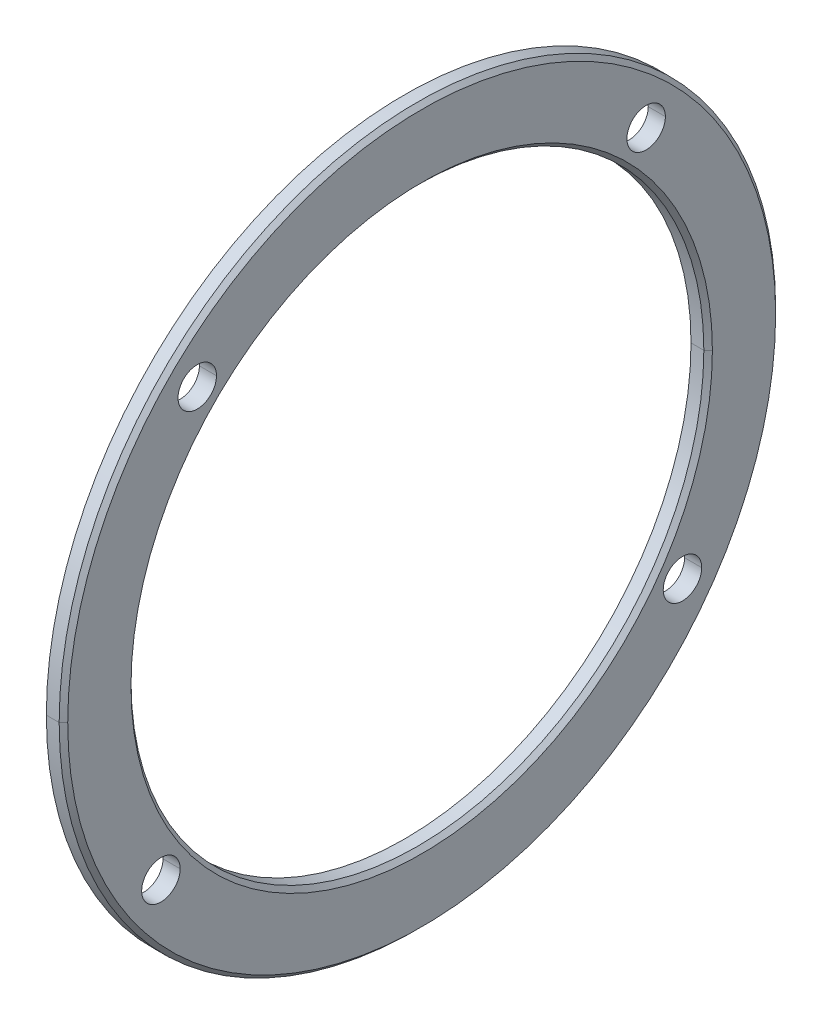
ISO-10303-21;
HEADER;
FILE_DESCRIPTION(('STEP AP214'),'2;1');
FILE_NAME('part.step','',(''),(''),'','','');
FILE_SCHEMA(('AUTOMOTIVE_DESIGN { 1 0 10303 214 1 1 1 1 }'));
ENDSEC;
DATA;
#1=APPLICATION_CONTEXT('core data for automotive mechanical design processes');
#2=APPLICATION_PROTOCOL_DEFINITION('international standard','automotive_design',2000,#1);
#3=PRODUCT_CONTEXT('',#1,'mechanical');
#4=PRODUCT('Part','Part','',(#3));
#5=PRODUCT_RELATED_PRODUCT_CATEGORY('part','',(#4));
#6=PRODUCT_DEFINITION_FORMATION('','',#4);
#7=PRODUCT_DEFINITION_CONTEXT('part definition',#1,'design');
#8=PRODUCT_DEFINITION('design','',#6,#7);
#9=PRODUCT_DEFINITION_SHAPE('','',#8);
#10=(LENGTH_UNIT() NAMED_UNIT(*) SI_UNIT(.MILLI.,.METRE.));
#11=(NAMED_UNIT(*) PLANE_ANGLE_UNIT() SI_UNIT($,.RADIAN.));
#12=(NAMED_UNIT(*) SI_UNIT($,.STERADIAN.) SOLID_ANGLE_UNIT());
#13=UNCERTAINTY_MEASURE_WITH_UNIT(LENGTH_MEASURE(1.E-05),#10,'distance_accuracy_value','');
#14=(GEOMETRIC_REPRESENTATION_CONTEXT(3) GLOBAL_UNCERTAINTY_ASSIGNED_CONTEXT((#13)) GLOBAL_UNIT_ASSIGNED_CONTEXT((#10,
#11,#12)) REPRESENTATION_CONTEXT('',''));
#15=CARTESIAN_POINT('',(0.,0.,0.));
#16=DIRECTION('',(0.,0.,1.));
#17=DIRECTION('',(1.,0.,0.));
#18=AXIS2_PLACEMENT_3D('',#15,#16,#17);
#19=CARTESIAN_POINT('',(1.5,0.,0.));
#20=DIRECTION('',(1.,0.,0.));
#21=DIRECTION('',(0.,0.,-1.));
#22=AXIS2_PLACEMENT_3D('',#19,#20,#21);
#23=CONICAL_SURFACE('',#22,33.5,0.785398163397442);
#24=DIRECTION('',(0.707106781186553,0.,0.707106781186543));
#25=VECTOR('',#24,1.);
#26=CARTESIAN_POINT('',(1.5,0.,33.5));
#27=LINE('',#26,#25);
#28=CARTESIAN_POINT('',(1.5,0.,33.5));
#29=VERTEX_POINT('',#28);
#30=CARTESIAN_POINT('',(2.,0.,34.));
#31=VERTEX_POINT('',#30);
#32=EDGE_CURVE('E319',#29,#31,#27,.T.);
#33=ORIENTED_EDGE('',*,*,#32,.F.);
#34=CARTESIAN_POINT('',(1.5,0.,0.));
#35=DIRECTION('',(1.,0.,0.));
#36=DIRECTION('',(0.,0.,-1.));
#37=AXIS2_PLACEMENT_3D('',#34,#35,#36);
#38=CIRCLE('',#37,33.5);
#39=CARTESIAN_POINT('',(1.5,0.,-33.5));
#40=VERTEX_POINT('',#39);
#41=EDGE_CURVE('E10',#40,#29,#38,.T.);
#42=ORIENTED_EDGE('',*,*,#41,.F.);
#43=DIRECTION('',(0.707106781186553,0.,-0.707106781186543));
#44=VECTOR('',#43,1.);
#45=CARTESIAN_POINT('',(1.5,0.,-33.5));
#46=LINE('',#45,#44);
#47=CARTESIAN_POINT('',(2.,0.,-34.));
#48=VERTEX_POINT('',#47);
#49=EDGE_CURVE('E231',#40,#48,#46,.T.);
#50=ORIENTED_EDGE('',*,*,#49,.T.);
#51=CARTESIAN_POINT('',(2.,0.,0.));
#52=DIRECTION('',(-1.,0.,0.));
#53=DIRECTION('',(0.,0.,-1.));
#54=AXIS2_PLACEMENT_3D('',#51,#52,#53);
#55=CIRCLE('',#54,34.);
#56=EDGE_CURVE('E181',#31,#48,#55,.T.);
#57=ORIENTED_EDGE('',*,*,#56,.F.);
#58=EDGE_LOOP('',(#33,#42,#50,#57));
#59=FACE_BOUND('',#58,.T.);
#60=ADVANCED_FACE('F16',(#59),#23,.F.);
#61=CARTESIAN_POINT('',(2.,0.,0.));
#62=DIRECTION('',(-1.,0.,0.));
#63=DIRECTION('',(0.,0.,1.));
#64=AXIS2_PLACEMENT_3D('',#61,#62,#63);
#65=CONICAL_SURFACE('',#64,41.4,0.785398163397469);
#66=DIRECTION('',(-0.707106781186533,0.,-0.707106781186562));
#67=VECTOR('',#66,1.);
#68=CARTESIAN_POINT('',(2.,0.,-41.4));
#69=LINE('',#68,#67);
#70=CARTESIAN_POINT('',(2.,0.,-41.4));
#71=VERTEX_POINT('',#70);
#72=CARTESIAN_POINT('',(1.49999999999999,0.,-41.9));
#73=VERTEX_POINT('',#72);
#74=EDGE_CURVE('E257',#71,#73,#69,.T.);
#75=ORIENTED_EDGE('',*,*,#74,.F.);
#76=CARTESIAN_POINT('',(2.,0.,0.));
#77=DIRECTION('',(1.,0.,0.));
#78=DIRECTION('',(0.,0.,-1.));
#79=AXIS2_PLACEMENT_3D('',#76,#77,#78);
#80=CIRCLE('',#79,41.4);
#81=CARTESIAN_POINT('',(2.,0.,41.4));
#82=VERTEX_POINT('',#81);
#83=EDGE_CURVE('E191',#82,#71,#80,.T.);
#84=ORIENTED_EDGE('',*,*,#83,.F.);
#85=DIRECTION('',(-0.707106781186533,0.,0.707106781186562));
#86=VECTOR('',#85,1.);
#87=CARTESIAN_POINT('',(2.,0.,41.4));
#88=LINE('',#87,#86);
#89=CARTESIAN_POINT('',(1.49999999999999,0.,41.9));
#90=VERTEX_POINT('',#89);
#91=EDGE_CURVE('E288',#82,#90,#88,.T.);
#92=ORIENTED_EDGE('',*,*,#91,.T.);
#93=CARTESIAN_POINT('',(1.49999999999999,0.,0.));
#94=DIRECTION('',(-1.,0.,0.));
#95=DIRECTION('',(0.,0.,-1.));
#96=AXIS2_PLACEMENT_3D('',#93,#94,#95);
#97=CIRCLE('',#96,41.9);
#98=EDGE_CURVE('E27',#73,#90,#97,.T.);
#99=ORIENTED_EDGE('',*,*,#98,.F.);
#100=EDGE_LOOP('',(#75,#84,#92,#99));
#101=FACE_BOUND('',#100,.T.);
#102=ADVANCED_FACE('F483',(#101),#65,.T.);
#103=CARTESIAN_POINT('',(0.,-21.3834632767664,30.5));
#104=DIRECTION('',(1.,0.,0.));
#105=DIRECTION('',(0.,0.,-1.));
#106=AXIS2_PLACEMENT_3D('',#103,#104,#105);
#107=CYLINDRICAL_SURFACE('',#106,2.25);
#108=DIRECTION('',(1.,0.,0.));
#109=VECTOR('',#108,1.);
#110=CARTESIAN_POINT('',(0.,-21.3834632767664,32.75));
#111=LINE('',#110,#109);
#112=CARTESIAN_POINT('',(0.,-21.3834632767664,32.75));
#113=VERTEX_POINT('',#112);
#114=CARTESIAN_POINT('',(2.,-21.3834632767664,32.75));
#115=VERTEX_POINT('',#114);
#116=EDGE_CURVE('E276',#113,#115,#111,.T.);
#117=ORIENTED_EDGE('',*,*,#116,.F.);
#118=CARTESIAN_POINT('',(0.,-21.3834632767664,30.5));
#119=DIRECTION('',(1.,0.,0.));
#120=DIRECTION('',(0.,0.,-1.));
#121=AXIS2_PLACEMENT_3D('',#118,#119,#120);
#122=CIRCLE('',#121,2.25);
#123=CARTESIAN_POINT('',(0.,-21.3834632767664,28.25));
#124=VERTEX_POINT('',#123);
#125=EDGE_CURVE('E259',#124,#113,#122,.T.);
#126=ORIENTED_EDGE('',*,*,#125,.F.);
#127=DIRECTION('',(1.,0.,0.));
#128=VECTOR('',#127,1.);
#129=CARTESIAN_POINT('',(0.,-21.3834632767664,28.25));
#130=LINE('',#129,#128);
#131=CARTESIAN_POINT('',(2.,-21.3834632767664,28.25));
#132=VERTEX_POINT('',#131);
#133=EDGE_CURVE('E177',#124,#132,#130,.T.);
#134=ORIENTED_EDGE('',*,*,#133,.T.);
#135=CARTESIAN_POINT('',(2.,-21.3834632767664,30.5));
#136=DIRECTION('',(1.,0.,0.));
#137=DIRECTION('',(0.,0.,-1.));
#138=AXIS2_PLACEMENT_3D('',#135,#136,#137);
#139=CIRCLE('',#138,2.25);
#140=EDGE_CURVE('E179',#132,#115,#139,.T.);
#141=ORIENTED_EDGE('',*,*,#140,.T.);
#142=EDGE_LOOP('',(#117,#126,#134,#141));
#143=FACE_BOUND('',#142,.T.);
#144=ADVANCED_FACE('F492',(#143),#107,.F.);
#145=CARTESIAN_POINT('',(0.,-21.3834632767664,-30.5));
#146=DIRECTION('',(1.,0.,0.));
#147=DIRECTION('',(0.,0.,-1.));
#148=AXIS2_PLACEMENT_3D('',#145,#146,#147);
#149=CYLINDRICAL_SURFACE('',#148,2.25);
#150=DIRECTION('',(1.,0.,0.));
#151=VECTOR('',#150,1.);
#152=CARTESIAN_POINT('',(0.,-21.3834632767664,-28.25));
#153=LINE('',#152,#151);
#154=CARTESIAN_POINT('',(0.,-21.3834632767664,-28.25));
#155=VERTEX_POINT('',#154);
#156=CARTESIAN_POINT('',(2.,-21.3834632767664,-28.25));
#157=VERTEX_POINT('',#156);
#158=EDGE_CURVE('E299',#155,#157,#153,.T.);
#159=ORIENTED_EDGE('',*,*,#158,.F.);
#160=CARTESIAN_POINT('',(0.,-21.3834632767664,-30.5));
#161=DIRECTION('',(1.,0.,0.));
#162=DIRECTION('',(0.,0.,-1.));
#163=AXIS2_PLACEMENT_3D('',#160,#161,#162);
#164=CIRCLE('',#163,2.25);
#165=CARTESIAN_POINT('',(0.,-21.3834632767664,-32.75));
#166=VERTEX_POINT('',#165);
#167=EDGE_CURVE('E152',#166,#155,#164,.T.);
#168=ORIENTED_EDGE('',*,*,#167,.F.);
#169=DIRECTION('',(1.,0.,0.));
#170=VECTOR('',#169,1.);
#171=CARTESIAN_POINT('',(0.,-21.3834632767664,-32.75));
#172=LINE('',#171,#170);
#173=CARTESIAN_POINT('',(2.,-21.3834632767664,-32.75));
#174=VERTEX_POINT('',#173);
#175=EDGE_CURVE('E165',#166,#174,#172,.T.);
#176=ORIENTED_EDGE('',*,*,#175,.T.);
#177=CARTESIAN_POINT('',(2.,-21.3834632767664,-30.5));
#178=DIRECTION('',(1.,0.,0.));
#179=DIRECTION('',(0.,0.,-1.));
#180=AXIS2_PLACEMENT_3D('',#177,#178,#179);
#181=CIRCLE('',#180,2.25);
#182=EDGE_CURVE('E20',#174,#157,#181,.T.);
#183=ORIENTED_EDGE('',*,*,#182,.T.);
#184=EDGE_LOOP('',(#159,#168,#176,#183));
#185=FACE_BOUND('',#184,.T.);
#186=ADVANCED_FACE('F365',(#185),#149,.F.);
#187=CARTESIAN_POINT('',(0.,26.4280154704968,-26.25));
#188=DIRECTION('',(1.,0.,0.));
#189=DIRECTION('',(0.,0.,-1.));
#190=AXIS2_PLACEMENT_3D('',#187,#188,#189);
#191=CYLINDRICAL_SURFACE('',#190,2.25);
#192=DIRECTION('',(1.,0.,0.));
#193=VECTOR('',#192,1.);
#194=CARTESIAN_POINT('',(0.,26.4280154704968,-24.));
#195=LINE('',#194,#193);
#196=CARTESIAN_POINT('',(0.,26.4280154704968,-24.));
#197=VERTEX_POINT('',#196);
#198=CARTESIAN_POINT('',(2.,26.4280154704968,-24.));
#199=VERTEX_POINT('',#198);
#200=EDGE_CURVE('E146',#197,#199,#195,.T.);
#201=ORIENTED_EDGE('',*,*,#200,.F.);
#202=CARTESIAN_POINT('',(0.,26.4280154704968,-26.25));
#203=DIRECTION('',(1.,0.,0.));
#204=DIRECTION('',(0.,0.,-1.));
#205=AXIS2_PLACEMENT_3D('',#202,#203,#204);
#206=CIRCLE('',#205,2.25);
#207=CARTESIAN_POINT('',(0.,26.4280154704968,-28.5));
#208=VERTEX_POINT('',#207);
#209=EDGE_CURVE('E141',#208,#197,#206,.T.);
#210=ORIENTED_EDGE('',*,*,#209,.F.);
#211=DIRECTION('',(1.,0.,0.));
#212=VECTOR('',#211,1.);
#213=CARTESIAN_POINT('',(0.,26.4280154704968,-28.5));
#214=LINE('',#213,#212);
#215=CARTESIAN_POINT('',(2.,26.4280154704968,-28.5));
#216=VERTEX_POINT('',#215);
#217=EDGE_CURVE('E143',#208,#216,#214,.T.);
#218=ORIENTED_EDGE('',*,*,#217,.T.);
#219=CARTESIAN_POINT('',(2.,26.4280154704968,-26.25));
#220=DIRECTION('',(1.,0.,0.));
#221=DIRECTION('',(0.,0.,-1.));
#222=AXIS2_PLACEMENT_3D('',#219,#220,#221);
#223=CIRCLE('',#222,2.25);
#224=EDGE_CURVE('E190',#216,#199,#223,.T.);
#225=ORIENTED_EDGE('',*,*,#224,.T.);
#226=EDGE_LOOP('',(#201,#210,#218,#225));
#227=FACE_BOUND('',#226,.T.);
#228=ADVANCED_FACE('F18',(#227),#191,.F.);
#229=CARTESIAN_POINT('',(0.,26.4280154704968,26.25));
#230=DIRECTION('',(1.,0.,0.));
#231=DIRECTION('',(0.,0.,-1.));
#232=AXIS2_PLACEMENT_3D('',#229,#230,#231);
#233=CYLINDRICAL_SURFACE('',#232,2.25);
#234=DIRECTION('',(1.,0.,0.));
#235=VECTOR('',#234,1.);
#236=CARTESIAN_POINT('',(0.,26.4280154704968,28.5));
#237=LINE('',#236,#235);
#238=CARTESIAN_POINT('',(0.,26.4280154704968,28.5));
#239=VERTEX_POINT('',#238);
#240=CARTESIAN_POINT('',(2.,26.4280154704968,28.5));
#241=VERTEX_POINT('',#240);
#242=EDGE_CURVE('E279',#239,#241,#237,.T.);
#243=ORIENTED_EDGE('',*,*,#242,.F.);
#244=CARTESIAN_POINT('',(0.,26.4280154704968,26.25));
#245=DIRECTION('',(1.,0.,0.));
#246=DIRECTION('',(0.,0.,-1.));
#247=AXIS2_PLACEMENT_3D('',#244,#245,#246);
#248=CIRCLE('',#247,2.25);
#249=CARTESIAN_POINT('',(0.,26.4280154704968,24.));
#250=VERTEX_POINT('',#249);
#251=EDGE_CURVE('E151',#250,#239,#248,.T.);
#252=ORIENTED_EDGE('',*,*,#251,.F.);
#253=DIRECTION('',(1.,0.,0.));
#254=VECTOR('',#253,1.);
#255=CARTESIAN_POINT('',(0.,26.4280154704968,24.));
#256=LINE('',#255,#254);
#257=CARTESIAN_POINT('',(2.,26.4280154704968,24.));
#258=VERTEX_POINT('',#257);
#259=EDGE_CURVE('E203',#250,#258,#256,.T.);
#260=ORIENTED_EDGE('',*,*,#259,.T.);
#261=CARTESIAN_POINT('',(2.,26.4280154704968,26.25));
#262=DIRECTION('',(1.,0.,0.));
#263=DIRECTION('',(0.,0.,-1.));
#264=AXIS2_PLACEMENT_3D('',#261,#262,#263);
#265=CIRCLE('',#264,2.25);
#266=EDGE_CURVE('E207',#258,#241,#265,.T.);
#267=ORIENTED_EDGE('',*,*,#266,.T.);
#268=EDGE_LOOP('',(#243,#252,#260,#267));
#269=FACE_BOUND('',#268,.T.);
#270=ADVANCED_FACE('F364',(#269),#233,.F.);
#271=CARTESIAN_POINT('',(2.,0.,0.));
#272=DIRECTION('',(-1.,0.,0.));
#273=DIRECTION('',(0.,0.,1.));
#274=AXIS2_PLACEMENT_3D('',#271,#272,#273);
#275=CYLINDRICAL_SURFACE('',#274,33.5);
#276=DIRECTION('',(-1.,0.,0.));
#277=VECTOR('',#276,1.);
#278=CARTESIAN_POINT('',(2.,0.,-33.5));
#279=LINE('',#278,#277);
#280=CARTESIAN_POINT('',(0.,0.,-33.5));
#281=VERTEX_POINT('',#280);
#282=EDGE_CURVE('E248',#40,#281,#279,.T.);
#283=ORIENTED_EDGE('',*,*,#282,.F.);
#284=ORIENTED_EDGE('',*,*,#41,.T.);
#285=DIRECTION('',(-1.,0.,0.));
#286=VECTOR('',#285,1.);
#287=CARTESIAN_POINT('',(2.,0.,33.5));
#288=LINE('',#287,#286);
#289=CARTESIAN_POINT('',(0.,0.,33.5));
#290=VERTEX_POINT('',#289);
#291=EDGE_CURVE('E234',#29,#290,#288,.T.);
#292=ORIENTED_EDGE('',*,*,#291,.T.);
#293=CARTESIAN_POINT('',(0.,0.,0.));
#294=DIRECTION('',(1.,0.,0.));
#295=DIRECTION('',(0.,0.,-1.));
#296=AXIS2_PLACEMENT_3D('',#293,#294,#295);
#297=CIRCLE('',#296,33.5);
#298=EDGE_CURVE('E209',#281,#290,#297,.T.);
#299=ORIENTED_EDGE('',*,*,#298,.F.);
#300=EDGE_LOOP('',(#283,#284,#292,#299));
#301=FACE_BOUND('',#300,.T.);
#302=ADVANCED_FACE('F377',(#301),#275,.F.);
#303=CARTESIAN_POINT('',(2.,0.,0.));
#304=DIRECTION('',(-1.,0.,0.));
#305=DIRECTION('',(0.,0.,1.));
#306=AXIS2_PLACEMENT_3D('',#303,#304,#305);
#307=CYLINDRICAL_SURFACE('',#306,41.9);
#308=DIRECTION('',(-1.,0.,0.));
#309=VECTOR('',#308,1.);
#310=CARTESIAN_POINT('',(2.,0.,-41.9));
#311=LINE('',#310,#309);
#312=CARTESIAN_POINT('',(0.,0.,-41.9));
#313=VERTEX_POINT('',#312);
#314=EDGE_CURVE('E236',#73,#313,#311,.T.);
#315=ORIENTED_EDGE('',*,*,#314,.F.);
#316=ORIENTED_EDGE('',*,*,#98,.T.);
#317=DIRECTION('',(-1.,0.,0.));
#318=VECTOR('',#317,1.);
#319=CARTESIAN_POINT('',(2.,0.,41.9));
#320=LINE('',#319,#318);
#321=CARTESIAN_POINT('',(0.,0.,41.9));
#322=VERTEX_POINT('',#321);
#323=EDGE_CURVE('E199',#90,#322,#320,.T.);
#324=ORIENTED_EDGE('',*,*,#323,.T.);
#325=CARTESIAN_POINT('',(0.,0.,0.));
#326=DIRECTION('',(1.,0.,0.));
#327=DIRECTION('',(0.,0.,-1.));
#328=AXIS2_PLACEMENT_3D('',#325,#326,#327);
#329=CIRCLE('',#328,41.9);
#330=EDGE_CURVE('E41',#322,#313,#329,.T.);
#331=ORIENTED_EDGE('',*,*,#330,.T.);
#332=EDGE_LOOP('',(#315,#316,#324,#331));
#333=FACE_BOUND('',#332,.T.);
#334=ADVANCED_FACE('F385',(#333),#307,.T.);
#335=CARTESIAN_POINT('',(0.,0.,0.));
#336=DIRECTION('',(1.,0.,0.));
#337=DIRECTION('',(0.,1.,0.));
#338=AXIS2_PLACEMENT_3D('',#335,#336,#337);
#339=PLANE('',#338);
#340=CARTESIAN_POINT('',(0.,0.,0.));
#341=DIRECTION('',(1.,0.,0.));
#342=DIRECTION('',(0.,0.,-1.));
#343=AXIS2_PLACEMENT_3D('',#340,#341,#342);
#344=CIRCLE('',#343,33.5);
#345=EDGE_CURVE('E237',#290,#281,#344,.T.);
#346=ORIENTED_EDGE('',*,*,#345,.T.);
#347=ORIENTED_EDGE('',*,*,#298,.T.);
#348=EDGE_LOOP('',(#346,#347));
#349=FACE_BOUND('',#348,.T.);
#350=ORIENTED_EDGE('',*,*,#251,.T.);
#351=CARTESIAN_POINT('',(0.,26.4280154704968,26.25));
#352=DIRECTION('',(1.,0.,0.));
#353=DIRECTION('',(0.,0.,-1.));
#354=AXIS2_PLACEMENT_3D('',#351,#352,#353);
#355=CIRCLE('',#354,2.25);
#356=EDGE_CURVE('E160',#239,#250,#355,.T.);
#357=ORIENTED_EDGE('',*,*,#356,.T.);
#358=EDGE_LOOP('',(#350,#357));
#359=FACE_BOUND('',#358,.T.);
#360=ORIENTED_EDGE('',*,*,#209,.T.);
#361=CARTESIAN_POINT('',(0.,26.4280154704968,-26.25));
#362=DIRECTION('',(1.,0.,0.));
#363=DIRECTION('',(0.,0.,-1.));
#364=AXIS2_PLACEMENT_3D('',#361,#362,#363);
#365=CIRCLE('',#364,2.25);
#366=EDGE_CURVE('E156',#197,#208,#365,.T.);
#367=ORIENTED_EDGE('',*,*,#366,.T.);
#368=EDGE_LOOP('',(#360,#367));
#369=FACE_BOUND('',#368,.T.);
#370=ORIENTED_EDGE('',*,*,#167,.T.);
#371=CARTESIAN_POINT('',(0.,-21.3834632767664,-30.5));
#372=DIRECTION('',(1.,0.,0.));
#373=DIRECTION('',(0.,0.,-1.));
#374=AXIS2_PLACEMENT_3D('',#371,#372,#373);
#375=CIRCLE('',#374,2.25);
#376=EDGE_CURVE('E303',#155,#166,#375,.T.);
#377=ORIENTED_EDGE('',*,*,#376,.T.);
#378=EDGE_LOOP('',(#370,#377));
#379=FACE_BOUND('',#378,.T.);
#380=ORIENTED_EDGE('',*,*,#125,.T.);
#381=CARTESIAN_POINT('',(0.,-21.3834632767664,30.5));
#382=DIRECTION('',(1.,0.,0.));
#383=DIRECTION('',(0.,0.,-1.));
#384=AXIS2_PLACEMENT_3D('',#381,#382,#383);
#385=CIRCLE('',#384,2.25);
#386=EDGE_CURVE('E289',#113,#124,#385,.T.);
#387=ORIENTED_EDGE('',*,*,#386,.T.);
#388=EDGE_LOOP('',(#380,#387));
#389=FACE_BOUND('',#388,.T.);
#390=ORIENTED_EDGE('',*,*,#330,.F.);
#391=CARTESIAN_POINT('',(0.,0.,0.));
#392=DIRECTION('',(1.,0.,0.));
#393=DIRECTION('',(0.,0.,-1.));
#394=AXIS2_PLACEMENT_3D('',#391,#392,#393);
#395=CIRCLE('',#394,41.9);
#396=EDGE_CURVE('E246',#313,#322,#395,.T.);
#397=ORIENTED_EDGE('',*,*,#396,.F.);
#398=EDGE_LOOP('',(#390,#397));
#399=FACE_BOUND('',#398,.T.);
#400=ADVANCED_FACE('F162',(#349,#359,#369,#379,#389,#399),#339,.F.);
#401=CARTESIAN_POINT('',(2.,0.,0.));
#402=DIRECTION('',(1.,0.,0.));
#403=DIRECTION('',(0.,1.,0.));
#404=AXIS2_PLACEMENT_3D('',#401,#402,#403);
#405=PLANE('',#404);
#406=ORIENTED_EDGE('',*,*,#266,.F.);
#407=CARTESIAN_POINT('',(2.,26.4280154704968,26.25));
#408=DIRECTION('',(1.,0.,0.));
#409=DIRECTION('',(0.,0.,-1.));
#410=AXIS2_PLACEMENT_3D('',#407,#408,#409);
#411=CIRCLE('',#410,2.25);
#412=EDGE_CURVE('E283',#241,#258,#411,.T.);
#413=ORIENTED_EDGE('',*,*,#412,.F.);
#414=EDGE_LOOP('',(#406,#413));
#415=FACE_BOUND('',#414,.T.);
#416=ORIENTED_EDGE('',*,*,#224,.F.);
#417=CARTESIAN_POINT('',(2.,26.4280154704968,-26.25));
#418=DIRECTION('',(1.,0.,0.));
#419=DIRECTION('',(0.,0.,-1.));
#420=AXIS2_PLACEMENT_3D('',#417,#418,#419);
#421=CIRCLE('',#420,2.25);
#422=EDGE_CURVE('E158',#199,#216,#421,.T.);
#423=ORIENTED_EDGE('',*,*,#422,.F.);
#424=EDGE_LOOP('',(#416,#423));
#425=FACE_BOUND('',#424,.T.);
#426=ORIENTED_EDGE('',*,*,#182,.F.);
#427=CARTESIAN_POINT('',(2.,-21.3834632767664,-30.5));
#428=DIRECTION('',(1.,0.,0.));
#429=DIRECTION('',(0.,0.,-1.));
#430=AXIS2_PLACEMENT_3D('',#427,#428,#429);
#431=CIRCLE('',#430,2.25);
#432=EDGE_CURVE('E174',#157,#174,#431,.T.);
#433=ORIENTED_EDGE('',*,*,#432,.F.);
#434=EDGE_LOOP('',(#426,#433));
#435=FACE_BOUND('',#434,.T.);
#436=ORIENTED_EDGE('',*,*,#140,.F.);
#437=CARTESIAN_POINT('',(2.,-21.3834632767664,30.5));
#438=DIRECTION('',(1.,0.,0.));
#439=DIRECTION('',(0.,0.,-1.));
#440=AXIS2_PLACEMENT_3D('',#437,#438,#439);
#441=CIRCLE('',#440,2.25);
#442=EDGE_CURVE('E292',#115,#132,#441,.T.);
#443=ORIENTED_EDGE('',*,*,#442,.F.);
#444=EDGE_LOOP('',(#436,#443));
#445=FACE_BOUND('',#444,.T.);
#446=CARTESIAN_POINT('',(2.,0.,0.));
#447=DIRECTION('',(-1.,0.,0.));
#448=DIRECTION('',(0.,0.,-1.));
#449=AXIS2_PLACEMENT_3D('',#446,#447,#448);
#450=CIRCLE('',#449,34.);
#451=EDGE_CURVE('E233',#48,#31,#450,.T.);
#452=ORIENTED_EDGE('',*,*,#451,.T.);
#453=ORIENTED_EDGE('',*,*,#56,.T.);
#454=EDGE_LOOP('',(#452,#453));
#455=FACE_BOUND('',#454,.T.);
#456=ORIENTED_EDGE('',*,*,#83,.T.);
#457=CARTESIAN_POINT('',(2.,0.,0.));
#458=DIRECTION('',(1.,0.,0.));
#459=DIRECTION('',(0.,0.,-1.));
#460=AXIS2_PLACEMENT_3D('',#457,#458,#459);
#461=CIRCLE('',#460,41.4);
#462=EDGE_CURVE('E230',#71,#82,#461,.T.);
#463=ORIENTED_EDGE('',*,*,#462,.T.);
#464=EDGE_LOOP('',(#456,#463));
#465=FACE_BOUND('',#464,.T.);
#466=ADVANCED_FACE('F413',(#415,#425,#435,#445,#455,#465),#405,.T.);
#467=CARTESIAN_POINT('',(2.,0.,0.));
#468=DIRECTION('',(-1.,0.,0.));
#469=DIRECTION('',(0.,0.,1.));
#470=AXIS2_PLACEMENT_3D('',#467,#468,#469);
#471=CYLINDRICAL_SURFACE('',#470,41.9);
#472=CARTESIAN_POINT('',(1.49999999999999,0.,0.));
#473=DIRECTION('',(-1.,0.,0.));
#474=DIRECTION('',(0.,0.,-1.));
#475=AXIS2_PLACEMENT_3D('',#472,#473,#474);
#476=CIRCLE('',#475,41.9);
#477=EDGE_CURVE('E284',#90,#73,#476,.T.);
#478=ORIENTED_EDGE('',*,*,#477,.T.);
#479=ORIENTED_EDGE('',*,*,#314,.T.);
#480=ORIENTED_EDGE('',*,*,#396,.T.);
#481=ORIENTED_EDGE('',*,*,#323,.F.);
#482=EDGE_LOOP('',(#478,#479,#480,#481));
#483=FACE_BOUND('',#482,.T.);
#484=ADVANCED_FACE('F421',(#483),#471,.T.);
#485=CARTESIAN_POINT('',(2.,0.,0.));
#486=DIRECTION('',(-1.,0.,0.));
#487=DIRECTION('',(0.,0.,1.));
#488=AXIS2_PLACEMENT_3D('',#485,#486,#487);
#489=CYLINDRICAL_SURFACE('',#488,33.5);
#490=CARTESIAN_POINT('',(1.5,0.,0.));
#491=DIRECTION('',(1.,0.,0.));
#492=DIRECTION('',(0.,0.,-1.));
#493=AXIS2_PLACEMENT_3D('',#490,#491,#492);
#494=CIRCLE('',#493,33.5);
#495=EDGE_CURVE('E315',#29,#40,#494,.T.);
#496=ORIENTED_EDGE('',*,*,#495,.T.);
#497=ORIENTED_EDGE('',*,*,#282,.T.);
#498=ORIENTED_EDGE('',*,*,#345,.F.);
#499=ORIENTED_EDGE('',*,*,#291,.F.);
#500=EDGE_LOOP('',(#496,#497,#498,#499));
#501=FACE_BOUND('',#500,.T.);
#502=ADVANCED_FACE('F426',(#501),#489,.F.);
#503=CARTESIAN_POINT('',(0.,26.4280154704968,26.25));
#504=DIRECTION('',(1.,0.,0.));
#505=DIRECTION('',(0.,0.,-1.));
#506=AXIS2_PLACEMENT_3D('',#503,#504,#505);
#507=CYLINDRICAL_SURFACE('',#506,2.25);
#508=ORIENTED_EDGE('',*,*,#356,.F.);
#509=ORIENTED_EDGE('',*,*,#242,.T.);
#510=ORIENTED_EDGE('',*,*,#412,.T.);
#511=ORIENTED_EDGE('',*,*,#259,.F.);
#512=EDGE_LOOP('',(#508,#509,#510,#511));
#513=FACE_BOUND('',#512,.T.);
#514=ADVANCED_FACE('F340',(#513),#507,.F.);
#515=CARTESIAN_POINT('',(0.,26.4280154704968,-26.25));
#516=DIRECTION('',(1.,0.,0.));
#517=DIRECTION('',(0.,0.,-1.));
#518=AXIS2_PLACEMENT_3D('',#515,#516,#517);
#519=CYLINDRICAL_SURFACE('',#518,2.25);
#520=ORIENTED_EDGE('',*,*,#366,.F.);
#521=ORIENTED_EDGE('',*,*,#200,.T.);
#522=ORIENTED_EDGE('',*,*,#422,.T.);
#523=ORIENTED_EDGE('',*,*,#217,.F.);
#524=EDGE_LOOP('',(#520,#521,#522,#523));
#525=FACE_BOUND('',#524,.T.);
#526=ADVANCED_FACE('F155',(#525),#519,.F.);
#527=CARTESIAN_POINT('',(0.,-21.3834632767664,-30.5));
#528=DIRECTION('',(1.,0.,0.));
#529=DIRECTION('',(0.,0.,-1.));
#530=AXIS2_PLACEMENT_3D('',#527,#528,#529);
#531=CYLINDRICAL_SURFACE('',#530,2.25);
#532=ORIENTED_EDGE('',*,*,#376,.F.);
#533=ORIENTED_EDGE('',*,*,#158,.T.);
#534=ORIENTED_EDGE('',*,*,#432,.T.);
#535=ORIENTED_EDGE('',*,*,#175,.F.);
#536=EDGE_LOOP('',(#532,#533,#534,#535));
#537=FACE_BOUND('',#536,.T.);
#538=ADVANCED_FACE('F439',(#537),#531,.F.);
#539=CARTESIAN_POINT('',(0.,-21.3834632767664,30.5));
#540=DIRECTION('',(1.,0.,0.));
#541=DIRECTION('',(0.,0.,-1.));
#542=AXIS2_PLACEMENT_3D('',#539,#540,#541);
#543=CYLINDRICAL_SURFACE('',#542,2.25);
#544=ORIENTED_EDGE('',*,*,#386,.F.);
#545=ORIENTED_EDGE('',*,*,#116,.T.);
#546=ORIENTED_EDGE('',*,*,#442,.T.);
#547=ORIENTED_EDGE('',*,*,#133,.F.);
#548=EDGE_LOOP('',(#544,#545,#546,#547));
#549=FACE_BOUND('',#548,.T.);
#550=ADVANCED_FACE('F460',(#549),#543,.F.);
#551=CARTESIAN_POINT('',(2.,0.,0.));
#552=DIRECTION('',(-1.,0.,0.));
#553=DIRECTION('',(0.,0.,1.));
#554=AXIS2_PLACEMENT_3D('',#551,#552,#553);
#555=CONICAL_SURFACE('',#554,41.4,0.785398163397469);
#556=ORIENTED_EDGE('',*,*,#462,.F.);
#557=ORIENTED_EDGE('',*,*,#74,.T.);
#558=ORIENTED_EDGE('',*,*,#477,.F.);
#559=ORIENTED_EDGE('',*,*,#91,.F.);
#560=EDGE_LOOP('',(#556,#557,#558,#559));
#561=FACE_BOUND('',#560,.T.);
#562=ADVANCED_FACE('F402',(#561),#555,.T.);
#563=CARTESIAN_POINT('',(1.5,0.,0.));
#564=DIRECTION('',(1.,0.,0.));
#565=DIRECTION('',(0.,0.,-1.));
#566=AXIS2_PLACEMENT_3D('',#563,#564,#565);
#567=CONICAL_SURFACE('',#566,33.5,0.785398163397442);
#568=ORIENTED_EDGE('',*,*,#495,.F.);
#569=ORIENTED_EDGE('',*,*,#32,.T.);
#570=ORIENTED_EDGE('',*,*,#451,.F.);
#571=ORIENTED_EDGE('',*,*,#49,.F.);
#572=EDGE_LOOP('',(#568,#569,#570,#571));
#573=FACE_BOUND('',#572,.T.);
#574=ADVANCED_FACE('F397',(#573),#567,.F.);
#575=CLOSED_SHELL('',(#60,#102,#144,#186,#228,#270,#302,#334,#400,#466,#484,#502,#514,#526,#538,
#550,#562,#574));
#576=MANIFOLD_SOLID_BREP('B1',#575);
#577=ADVANCED_BREP_SHAPE_REPRESENTATION('',(#18,#576),#14);
#578=SHAPE_DEFINITION_REPRESENTATION(#9,#577);
ENDSEC;
END-ISO-10303-21;
